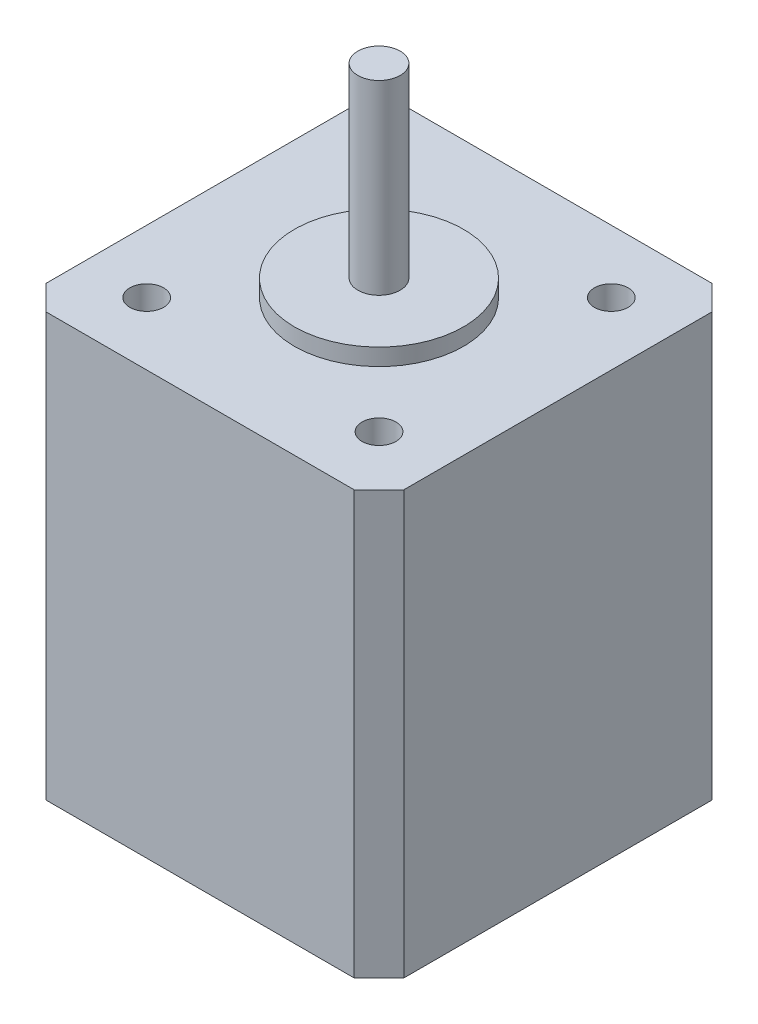
ISO-10303-21;
HEADER;
FILE_DESCRIPTION(('STEP AP214'),'2;1');
FILE_NAME('part.step','',(''),(''),'','','');
FILE_SCHEMA(('AUTOMOTIVE_DESIGN { 1 0 10303 214 1 1 1 1 }'));
ENDSEC;
DATA;
#1=APPLICATION_CONTEXT('core data for automotive mechanical design processes');
#2=APPLICATION_PROTOCOL_DEFINITION('international standard','automotive_design',2000,#1);
#3=PRODUCT_CONTEXT('',#1,'mechanical');
#4=PRODUCT('Part','Part','',(#3));
#5=PRODUCT_RELATED_PRODUCT_CATEGORY('part','',(#4));
#6=PRODUCT_DEFINITION_FORMATION('','',#4);
#7=PRODUCT_DEFINITION_CONTEXT('part definition',#1,'design');
#8=PRODUCT_DEFINITION('design','',#6,#7);
#9=PRODUCT_DEFINITION_SHAPE('','',#8);
#10=(LENGTH_UNIT() NAMED_UNIT(*) SI_UNIT(.MILLI.,.METRE.));
#11=(NAMED_UNIT(*) PLANE_ANGLE_UNIT() SI_UNIT($,.RADIAN.));
#12=(NAMED_UNIT(*) SI_UNIT($,.STERADIAN.) SOLID_ANGLE_UNIT());
#13=UNCERTAINTY_MEASURE_WITH_UNIT(LENGTH_MEASURE(1.E-05),#10,'distance_accuracy_value','');
#14=(GEOMETRIC_REPRESENTATION_CONTEXT(3) GLOBAL_UNCERTAINTY_ASSIGNED_CONTEXT((#13)) GLOBAL_UNIT_ASSIGNED_CONTEXT((#10,
#11,#12)) REPRESENTATION_CONTEXT('',''));
#15=CARTESIAN_POINT('',(0.,0.,0.));
#16=DIRECTION('',(0.,0.,1.));
#17=DIRECTION('',(1.,0.,0.));
#18=AXIS2_PLACEMENT_3D('',#15,#16,#17);
#19=CARTESIAN_POINT('',(-13.2034682080929,-50.,-17.7268786127169));
#20=DIRECTION('',(0.,0.,1.));
#21=DIRECTION('',(1.,0.,0.));
#22=AXIS2_PLACEMENT_3D('',#19,#20,#21);
#23=PLANE('',#22);
#24=DIRECTION('',(0.,-1.,0.));
#25=VECTOR('',#24,1.);
#26=CARTESIAN_POINT('',(8.22832369942179,-50.,-17.7268786127169));
#27=LINE('',#26,#25);
#28=CARTESIAN_POINT('',(8.22832369942179,-45.3103436402102,-17.7268786127169));
#29=VERTEX_POINT('',#28);
#30=CARTESIAN_POINT('',(8.22832369942179,-50.,-17.7268786127169));
#31=VERTEX_POINT('',#30);
#32=EDGE_CURVE('E162',#29,#31,#27,.T.);
#33=ORIENTED_EDGE('',*,*,#32,.F.);
#34=DIRECTION('',(1.,0.,0.));
#35=VECTOR('',#34,1.);
#36=CARTESIAN_POINT('',(8.22832369942179,-45.3103436402102,-17.7268786127169));
#37=LINE('',#36,#35);
#38=CARTESIAN_POINT('',(1.79653179190706,-45.3103436402102,-17.7268786127169));
#39=VERTEX_POINT('',#38);
#40=EDGE_CURVE('E315',#39,#29,#37,.T.);
#41=ORIENTED_EDGE('',*,*,#40,.F.);
#42=DIRECTION('',(0.,1.,0.));
#43=VECTOR('',#42,1.);
#44=CARTESIAN_POINT('',(1.79653179190706,-45.3103436402102,-17.7268786127169));
#45=LINE('',#44,#43);
#46=CARTESIAN_POINT('',(1.79653179190706,-50.,-17.7268786127169));
#47=VERTEX_POINT('',#46);
#48=EDGE_CURVE('E278',#47,#39,#45,.T.);
#49=ORIENTED_EDGE('',*,*,#48,.F.);
#50=DIRECTION('',(1.,0.,0.));
#51=VECTOR('',#50,1.);
#52=CARTESIAN_POINT('',(-13.2034682080929,-50.,-17.7268786127169));
#53=LINE('',#52,#51);
#54=CARTESIAN_POINT('',(-13.2034682080929,-50.,-17.7268786127169));
#55=VERTEX_POINT('',#54);
#56=EDGE_CURVE('E359',#55,#47,#53,.T.);
#57=ORIENTED_EDGE('',*,*,#56,.F.);
#58=DIRECTION('',(0.,1.,0.));
#59=VECTOR('',#58,1.);
#60=CARTESIAN_POINT('',(-13.2034682080929,-50.,-17.7268786127169));
#61=LINE('',#60,#59);
#62=CARTESIAN_POINT('',(-13.2034682080929,0.,-17.7268786127169));
#63=VERTEX_POINT('',#62);
#64=EDGE_CURVE('E413',#55,#63,#61,.T.);
#65=ORIENTED_EDGE('',*,*,#64,.T.);
#66=DIRECTION('',(1.,0.,0.));
#67=VECTOR('',#66,1.);
#68=CARTESIAN_POINT('',(-13.2034682080929,0.,-17.7268786127169));
#69=LINE('',#68,#67);
#70=CARTESIAN_POINT('',(23.2283236994218,0.,-17.7268786127169));
#71=VERTEX_POINT('',#70);
#72=EDGE_CURVE('E380',#63,#71,#69,.T.);
#73=ORIENTED_EDGE('',*,*,#72,.T.);
#74=DIRECTION('',(0.,1.,0.));
#75=VECTOR('',#74,1.);
#76=CARTESIAN_POINT('',(23.2283236994218,-50.,-17.7268786127169));
#77=LINE('',#76,#75);
#78=CARTESIAN_POINT('',(23.2283236994218,-50.,-17.7268786127169));
#79=VERTEX_POINT('',#78);
#80=EDGE_CURVE('E410',#79,#71,#77,.T.);
#81=ORIENTED_EDGE('',*,*,#80,.F.);
#82=EDGE_CURVE('E357',#31,#79,#53,.T.);
#83=ORIENTED_EDGE('',*,*,#82,.F.);
#84=EDGE_LOOP('',(#33,#41,#49,#57,#65,#73,#81,#83));
#85=FACE_BOUND('',#84,.T.);
#86=ADVANCED_FACE('F146',(#85),#23,.F.);
#87=CARTESIAN_POINT('',(5.01242774566448,2.,3.42312138728309));
#88=DIRECTION('',(0.,-1.,0.));
#89=DIRECTION('',(0.,0.,-1.));
#90=AXIS2_PLACEMENT_3D('',#87,#88,#89);
#91=CYLINDRICAL_SURFACE('',#90,10.);
#92=CARTESIAN_POINT('',(5.01242774566448,2.,3.42312138728309));
#93=DIRECTION('',(0.,1.,0.));
#94=DIRECTION('',(0.,0.,1.));
#95=AXIS2_PLACEMENT_3D('',#92,#93,#94);
#96=CIRCLE('',#95,10.);
#97=CARTESIAN_POINT('',(5.01242774566448,2.,13.4231213872831));
#98=VERTEX_POINT('',#97);
#99=EDGE_CURVE('E417',#98,#98,#96,.T.);
#100=ORIENTED_EDGE('',*,*,#99,.F.);
#101=EDGE_LOOP('',(#100));
#102=FACE_BOUND('',#101,.T.);
#103=CARTESIAN_POINT('',(5.01242774566448,0.,3.42312138728309));
#104=DIRECTION('',(0.,1.,0.));
#105=DIRECTION('',(0.,0.,1.));
#106=AXIS2_PLACEMENT_3D('',#103,#104,#105);
#107=CIRCLE('',#106,10.);
#108=CARTESIAN_POINT('',(5.01242774566448,0.,13.4231213872831));
#109=VERTEX_POINT('',#108);
#110=EDGE_CURVE('E416',#109,#109,#107,.T.);
#111=ORIENTED_EDGE('',*,*,#110,.T.);
#112=EDGE_LOOP('',(#111));
#113=FACE_BOUND('',#112,.T.);
#114=ADVANCED_FACE('F148',(#102,#113),#91,.T.);
#115=CARTESIAN_POINT('',(0.,2.,0.));
#116=DIRECTION('',(0.,1.,0.));
#117=DIRECTION('',(0.,0.,1.));
#118=AXIS2_PLACEMENT_3D('',#115,#116,#117);
#119=PLANE('',#118);
#120=CARTESIAN_POINT('',(5.01242774566448,2.,3.42312138728309));
#121=DIRECTION('',(0.,1.,0.));
#122=DIRECTION('',(0.,0.,1.));
#123=AXIS2_PLACEMENT_3D('',#120,#121,#122);
#124=CIRCLE('',#123,2.5);
#125=CARTESIAN_POINT('',(5.01242774566448,2.,5.92312138728309));
#126=VERTEX_POINT('',#125);
#127=EDGE_CURVE('E12',#126,#126,#124,.T.);
#128=ORIENTED_EDGE('',*,*,#127,.F.);
#129=EDGE_LOOP('',(#128));
#130=FACE_BOUND('',#129,.T.);
#131=ORIENTED_EDGE('',*,*,#99,.T.);
#132=EDGE_LOOP('',(#131));
#133=FACE_BOUND('',#132,.T.);
#134=ADVANCED_FACE('F461',(#130,#133),#119,.T.);
#135=CARTESIAN_POINT('',(-16.1375722543355,-50.,-14.7927745664743));
#136=DIRECTION('',(0.707106781186546,0.,0.707106781186549));
#137=DIRECTION('',(0.707106781186549,0.,-0.707106781186546));
#138=AXIS2_PLACEMENT_3D('',#135,#136,#137);
#139=PLANE('',#138);
#140=DIRECTION('',(0.707106781186549,0.,-0.707106781186547));
#141=VECTOR('',#140,1.);
#142=CARTESIAN_POINT('',(-16.1375722543355,0.,-14.7927745664743));
#143=LINE('',#142,#141);
#144=CARTESIAN_POINT('',(-16.1375722543355,0.,-14.7927745664743));
#145=VERTEX_POINT('',#144);
#146=EDGE_CURVE('E351',#145,#63,#143,.T.);
#147=ORIENTED_EDGE('',*,*,#146,.T.);
#148=ORIENTED_EDGE('',*,*,#64,.F.);
#149=DIRECTION('',(0.707106781186549,0.,-0.707106781186547));
#150=VECTOR('',#149,1.);
#151=CARTESIAN_POINT('',(-16.1375722543355,-50.,-14.7927745664743));
#152=LINE('',#151,#150);
#153=CARTESIAN_POINT('',(-16.1375722543355,-50.,-14.7927745664743));
#154=VERTEX_POINT('',#153);
#155=EDGE_CURVE('E354',#154,#55,#152,.T.);
#156=ORIENTED_EDGE('',*,*,#155,.F.);
#157=DIRECTION('',(0.,1.,0.));
#158=VECTOR('',#157,1.);
#159=CARTESIAN_POINT('',(-16.1375722543355,-50.,-14.7927745664743));
#160=LINE('',#159,#158);
#161=EDGE_CURVE('E377',#154,#145,#160,.T.);
#162=ORIENTED_EDGE('',*,*,#161,.T.);
#163=EDGE_LOOP('',(#147,#148,#156,#162));
#164=FACE_BOUND('',#163,.T.);
#165=ADVANCED_FACE('F467',(#164),#139,.F.);
#166=CARTESIAN_POINT('',(23.2283236994218,-50.,-17.7268786127169));
#167=DIRECTION('',(-0.707106781186538,0.,0.707106781186557));
#168=DIRECTION('',(0.707106781186557,0.,0.707106781186538));
#169=AXIS2_PLACEMENT_3D('',#166,#167,#168);
#170=PLANE('',#169);
#171=DIRECTION('',(0.707106781186557,0.,0.707106781186538));
#172=VECTOR('',#171,1.);
#173=CARTESIAN_POINT('',(23.2283236994218,0.,-17.7268786127169));
#174=LINE('',#173,#172);
#175=CARTESIAN_POINT('',(26.1624277456645,0.,-14.7927745664743));
#176=VERTEX_POINT('',#175);
#177=EDGE_CURVE('E382',#71,#176,#174,.T.);
#178=ORIENTED_EDGE('',*,*,#177,.T.);
#179=DIRECTION('',(0.,1.,0.));
#180=VECTOR('',#179,1.);
#181=CARTESIAN_POINT('',(26.1624277456645,-50.,-14.7927745664743));
#182=LINE('',#181,#180);
#183=CARTESIAN_POINT('',(26.1624277456645,-50.,-14.7927745664743));
#184=VERTEX_POINT('',#183);
#185=EDGE_CURVE('E408',#184,#176,#182,.T.);
#186=ORIENTED_EDGE('',*,*,#185,.F.);
#187=DIRECTION('',(0.707106781186557,0.,0.707106781186538));
#188=VECTOR('',#187,1.);
#189=CARTESIAN_POINT('',(23.2283236994218,-50.,-17.7268786127169));
#190=LINE('',#189,#188);
#191=EDGE_CURVE('E362',#79,#184,#190,.T.);
#192=ORIENTED_EDGE('',*,*,#191,.F.);
#193=ORIENTED_EDGE('',*,*,#80,.T.);
#194=EDGE_LOOP('',(#178,#186,#192,#193));
#195=FACE_BOUND('',#194,.T.);
#196=ADVANCED_FACE('F465',(#195),#170,.F.);
#197=CARTESIAN_POINT('',(26.1624277456645,-50.,21.6390173410403));
#198=DIRECTION('',(1.,0.,0.));
#199=DIRECTION('',(0.,0.,-1.));
#200=AXIS2_PLACEMENT_3D('',#197,#198,#199);
#201=PLANE('',#200);
#202=DIRECTION('',(0.,0.,-1.));
#203=VECTOR('',#202,1.);
#204=CARTESIAN_POINT('',(26.1624277456645,0.,21.6390173410403));
#205=LINE('',#204,#203);
#206=CARTESIAN_POINT('',(26.1624277456645,0.,21.6390173410403));
#207=VERTEX_POINT('',#206);
#208=EDGE_CURVE('E385',#207,#176,#205,.T.);
#209=ORIENTED_EDGE('',*,*,#208,.F.);
#210=DIRECTION('',(0.,1.,0.));
#211=VECTOR('',#210,1.);
#212=CARTESIAN_POINT('',(26.1624277456645,-50.,21.6390173410403));
#213=LINE('',#212,#211);
#214=CARTESIAN_POINT('',(26.1624277456645,-50.,21.6390173410403));
#215=VERTEX_POINT('',#214);
#216=EDGE_CURVE('E406',#215,#207,#213,.T.);
#217=ORIENTED_EDGE('',*,*,#216,.F.);
#218=DIRECTION('',(0.,0.,-1.));
#219=VECTOR('',#218,1.);
#220=CARTESIAN_POINT('',(26.1624277456645,-50.,21.6390173410403));
#221=LINE('',#220,#219);
#222=EDGE_CURVE('E364',#215,#184,#221,.T.);
#223=ORIENTED_EDGE('',*,*,#222,.T.);
#224=ORIENTED_EDGE('',*,*,#185,.T.);
#225=EDGE_LOOP('',(#209,#217,#223,#224));
#226=FACE_BOUND('',#225,.T.);
#227=ADVANCED_FACE('F519',(#226),#201,.T.);
#228=CARTESIAN_POINT('',(26.1624277456645,-50.,21.6390173410403));
#229=DIRECTION('',(-0.707106781186557,0.,-0.707106781186538));
#230=DIRECTION('',(-0.707106781186538,0.,0.707106781186557));
#231=AXIS2_PLACEMENT_3D('',#228,#229,#230);
#232=PLANE('',#231);
#233=DIRECTION('',(-0.707106781186538,0.,0.707106781186557));
#234=VECTOR('',#233,1.);
#235=CARTESIAN_POINT('',(26.1624277456645,0.,21.6390173410403));
#236=LINE('',#235,#234);
#237=CARTESIAN_POINT('',(23.2283236994218,0.,24.5731213872831));
#238=VERTEX_POINT('',#237);
#239=EDGE_CURVE('E388',#207,#238,#236,.T.);
#240=ORIENTED_EDGE('',*,*,#239,.T.);
#241=DIRECTION('',(0.,1.,0.));
#242=VECTOR('',#241,1.);
#243=CARTESIAN_POINT('',(23.2283236994218,-50.,24.5731213872831));
#244=LINE('',#243,#242);
#245=CARTESIAN_POINT('',(23.2283236994218,-50.,24.5731213872831));
#246=VERTEX_POINT('',#245);
#247=EDGE_CURVE('E404',#246,#238,#244,.T.);
#248=ORIENTED_EDGE('',*,*,#247,.F.);
#249=DIRECTION('',(-0.707106781186538,0.,0.707106781186557));
#250=VECTOR('',#249,1.);
#251=CARTESIAN_POINT('',(26.1624277456645,-50.,21.6390173410403));
#252=LINE('',#251,#250);
#253=EDGE_CURVE('E367',#215,#246,#252,.T.);
#254=ORIENTED_EDGE('',*,*,#253,.F.);
#255=ORIENTED_EDGE('',*,*,#216,.T.);
#256=EDGE_LOOP('',(#240,#248,#254,#255));
#257=FACE_BOUND('',#256,.T.);
#258=ADVANCED_FACE('F516',(#257),#232,.F.);
#259=CARTESIAN_POINT('',(-13.2034682080927,-50.,24.5731213872831));
#260=DIRECTION('',(0.,0.,1.));
#261=DIRECTION('',(1.,0.,0.));
#262=AXIS2_PLACEMENT_3D('',#259,#260,#261);
#263=PLANE('',#262);
#264=DIRECTION('',(1.,0.,0.));
#265=VECTOR('',#264,1.);
#266=CARTESIAN_POINT('',(-13.2034682080927,0.,24.5731213872831));
#267=LINE('',#266,#265);
#268=CARTESIAN_POINT('',(-13.2034682080927,0.,24.5731213872831));
#269=VERTEX_POINT('',#268);
#270=EDGE_CURVE('E391',#269,#238,#267,.T.);
#271=ORIENTED_EDGE('',*,*,#270,.F.);
#272=DIRECTION('',(0.,1.,0.));
#273=VECTOR('',#272,1.);
#274=CARTESIAN_POINT('',(-13.2034682080927,-50.,24.5731213872831));
#275=LINE('',#274,#273);
#276=CARTESIAN_POINT('',(-13.2034682080927,-50.,24.5731213872831));
#277=VERTEX_POINT('',#276);
#278=EDGE_CURVE('E402',#277,#269,#275,.T.);
#279=ORIENTED_EDGE('',*,*,#278,.F.);
#280=DIRECTION('',(1.,0.,0.));
#281=VECTOR('',#280,1.);
#282=CARTESIAN_POINT('',(-13.2034682080927,-50.,24.5731213872831));
#283=LINE('',#282,#281);
#284=EDGE_CURVE('E369',#277,#246,#283,.T.);
#285=ORIENTED_EDGE('',*,*,#284,.T.);
#286=ORIENTED_EDGE('',*,*,#247,.T.);
#287=EDGE_LOOP('',(#271,#279,#285,#286));
#288=FACE_BOUND('',#287,.T.);
#289=ADVANCED_FACE('F511',(#288),#263,.T.);
#290=CARTESIAN_POINT('',(-16.1375722543355,-50.,21.6390173410403));
#291=DIRECTION('',(-0.707106781186539,0.,0.707106781186556));
#292=DIRECTION('',(0.707106781186556,0.,0.707106781186539));
#293=AXIS2_PLACEMENT_3D('',#290,#291,#292);
#294=PLANE('',#293);
#295=DIRECTION('',(0.707106781186556,0.,0.707106781186539));
#296=VECTOR('',#295,1.);
#297=CARTESIAN_POINT('',(-16.1375722543355,0.,21.6390173410403));
#298=LINE('',#297,#296);
#299=CARTESIAN_POINT('',(-16.1375722543355,0.,21.6390173410403));
#300=VERTEX_POINT('',#299);
#301=EDGE_CURVE('E394',#300,#269,#298,.T.);
#302=ORIENTED_EDGE('',*,*,#301,.F.);
#303=DIRECTION('',(0.,1.,0.));
#304=VECTOR('',#303,1.);
#305=CARTESIAN_POINT('',(-16.1375722543355,-50.,21.6390173410403));
#306=LINE('',#305,#304);
#307=CARTESIAN_POINT('',(-16.1375722543355,-50.,21.6390173410403));
#308=VERTEX_POINT('',#307);
#309=EDGE_CURVE('E400',#308,#300,#306,.T.);
#310=ORIENTED_EDGE('',*,*,#309,.F.);
#311=DIRECTION('',(0.707106781186556,0.,0.707106781186539));
#312=VECTOR('',#311,1.);
#313=CARTESIAN_POINT('',(-16.1375722543355,-50.,21.6390173410403));
#314=LINE('',#313,#312);
#315=EDGE_CURVE('E372',#308,#277,#314,.T.);
#316=ORIENTED_EDGE('',*,*,#315,.T.);
#317=ORIENTED_EDGE('',*,*,#278,.T.);
#318=EDGE_LOOP('',(#302,#310,#316,#317));
#319=FACE_BOUND('',#318,.T.);
#320=ADVANCED_FACE('F506',(#319),#294,.T.);
#321=CARTESIAN_POINT('',(-16.1375722543355,-50.,21.6390173410403));
#322=DIRECTION('',(1.,0.,0.));
#323=DIRECTION('',(0.,0.,-1.));
#324=AXIS2_PLACEMENT_3D('',#321,#322,#323);
#325=PLANE('',#324);
#326=DIRECTION('',(0.,0.,-1.));
#327=VECTOR('',#326,1.);
#328=CARTESIAN_POINT('',(-16.1375722543355,0.,21.6390173410403));
#329=LINE('',#328,#327);
#330=EDGE_CURVE('E358',#300,#145,#329,.T.);
#331=ORIENTED_EDGE('',*,*,#330,.T.);
#332=ORIENTED_EDGE('',*,*,#161,.F.);
#333=DIRECTION('',(0.,0.,-1.));
#334=VECTOR('',#333,1.);
#335=CARTESIAN_POINT('',(-16.1375722543355,-50.,21.6390173410403));
#336=LINE('',#335,#334);
#337=EDGE_CURVE('E375',#308,#154,#336,.T.);
#338=ORIENTED_EDGE('',*,*,#337,.F.);
#339=ORIENTED_EDGE('',*,*,#309,.T.);
#340=EDGE_LOOP('',(#331,#332,#338,#339));
#341=FACE_BOUND('',#340,.T.);
#342=ADVANCED_FACE('F503',(#341),#325,.F.);
#343=CARTESIAN_POINT('',(0.,-50.,0.));
#344=DIRECTION('',(0.,-1.,0.));
#345=DIRECTION('',(0.,0.,-1.));
#346=AXIS2_PLACEMENT_3D('',#343,#344,#345);
#347=PLANE('',#346);
#348=CARTESIAN_POINT('',(18.7474277456645,-50.,17.1581213872833));
#349=DIRECTION('',(0.,1.,0.));
#350=DIRECTION('',(0.,0.,1.));
#351=AXIS2_PLACEMENT_3D('',#348,#349,#350);
#352=CIRCLE('',#351,2.);
#353=CARTESIAN_POINT('',(18.7474277456645,-50.,19.1581213872833));
#354=VERTEX_POINT('',#353);
#355=EDGE_CURVE('E330',#354,#354,#352,.T.);
#356=ORIENTED_EDGE('',*,*,#355,.T.);
#357=EDGE_LOOP('',(#356));
#358=FACE_BOUND('',#357,.T.);
#359=CARTESIAN_POINT('',(18.7474277456645,-50.,-10.3118786127167));
#360=DIRECTION('',(0.,1.,0.));
#361=DIRECTION('',(0.,0.,1.));
#362=AXIS2_PLACEMENT_3D('',#359,#360,#361);
#363=CIRCLE('',#362,1.99999999999986);
#364=CARTESIAN_POINT('',(18.7474277456645,-50.,-8.31187861271689));
#365=VERTEX_POINT('',#364);
#366=EDGE_CURVE('E336',#365,#365,#363,.T.);
#367=ORIENTED_EDGE('',*,*,#366,.T.);
#368=EDGE_LOOP('',(#367));
#369=FACE_BOUND('',#368,.T.);
#370=CARTESIAN_POINT('',(-8.72257225433554,-50.,-10.3118786127167));
#371=DIRECTION('',(0.,1.,0.));
#372=DIRECTION('',(0.,0.,1.));
#373=AXIS2_PLACEMENT_3D('',#370,#371,#372);
#374=CIRCLE('',#373,2.00000000000048);
#375=CARTESIAN_POINT('',(-8.72257225433554,-50.,-8.31187861271627));
#376=VERTEX_POINT('',#375);
#377=EDGE_CURVE('E342',#376,#376,#374,.T.);
#378=ORIENTED_EDGE('',*,*,#377,.T.);
#379=EDGE_LOOP('',(#378));
#380=FACE_BOUND('',#379,.T.);
#381=CARTESIAN_POINT('',(-8.72257225433554,-50.,17.1581213872833));
#382=DIRECTION('',(0.,1.,0.));
#383=DIRECTION('',(0.,0.,1.));
#384=AXIS2_PLACEMENT_3D('',#381,#382,#383);
#385=CIRCLE('',#384,2.00000000000034);
#386=CARTESIAN_POINT('',(-8.72257225433554,-50.,19.1581213872836));
#387=VERTEX_POINT('',#386);
#388=EDGE_CURVE('E348',#387,#387,#385,.T.);
#389=ORIENTED_EDGE('',*,*,#388,.T.);
#390=EDGE_LOOP('',(#389));
#391=FACE_BOUND('',#390,.T.);
#392=ORIENTED_EDGE('',*,*,#155,.T.);
#393=ORIENTED_EDGE('',*,*,#56,.T.);
#394=DIRECTION('',(0.,0.,1.));
#395=VECTOR('',#394,1.);
#396=CARTESIAN_POINT('',(1.79653179190705,-50.,-22.7268786127169));
#397=LINE('',#396,#395);
#398=CARTESIAN_POINT('',(1.79653179190705,-50.,-22.7268786127169));
#399=VERTEX_POINT('',#398);
#400=EDGE_CURVE('E326',#399,#47,#397,.T.);
#401=ORIENTED_EDGE('',*,*,#400,.F.);
#402=DIRECTION('',(-1.,0.,0.));
#403=VECTOR('',#402,1.);
#404=CARTESIAN_POINT('',(8.22832369942178,-50.,-22.7268786127169));
#405=LINE('',#404,#403);
#406=CARTESIAN_POINT('',(8.22832369942178,-50.,-22.7268786127169));
#407=VERTEX_POINT('',#406);
#408=EDGE_CURVE('E303',#407,#399,#405,.T.);
#409=ORIENTED_EDGE('',*,*,#408,.F.);
#410=DIRECTION('',(0.,0.,1.));
#411=VECTOR('',#410,1.);
#412=CARTESIAN_POINT('',(8.22832369942178,-50.,-22.7268786127169));
#413=LINE('',#412,#411);
#414=EDGE_CURVE('E312',#407,#31,#413,.T.);
#415=ORIENTED_EDGE('',*,*,#414,.T.);
#416=ORIENTED_EDGE('',*,*,#82,.T.);
#417=ORIENTED_EDGE('',*,*,#191,.T.);
#418=ORIENTED_EDGE('',*,*,#222,.F.);
#419=ORIENTED_EDGE('',*,*,#253,.T.);
#420=ORIENTED_EDGE('',*,*,#284,.F.);
#421=ORIENTED_EDGE('',*,*,#315,.F.);
#422=ORIENTED_EDGE('',*,*,#337,.T.);
#423=EDGE_LOOP('',(#392,#393,#401,#409,#415,#416,#417,#418,#419,#420,#421,#422));
#424=FACE_BOUND('',#423,.T.);
#425=ADVANCED_FACE('F484',(#358,#369,#380,#391,#424),#347,.T.);
#426=CARTESIAN_POINT('',(0.,0.,0.));
#427=DIRECTION('',(0.,-1.,0.));
#428=DIRECTION('',(0.,0.,-1.));
#429=AXIS2_PLACEMENT_3D('',#426,#427,#428);
#430=PLANE('',#429);
#431=ORIENTED_EDGE('',*,*,#110,.F.);
#432=EDGE_LOOP('',(#431));
#433=FACE_BOUND('',#432,.T.);
#434=CARTESIAN_POINT('',(18.7474277456645,0.,17.1581213872833));
#435=DIRECTION('',(0.,1.,0.));
#436=DIRECTION('',(0.,0.,1.));
#437=AXIS2_PLACEMENT_3D('',#434,#435,#436);
#438=CIRCLE('',#437,2.);
#439=CARTESIAN_POINT('',(18.7474277456645,0.,19.1581213872833));
#440=VERTEX_POINT('',#439);
#441=EDGE_CURVE('E329',#440,#440,#438,.T.);
#442=ORIENTED_EDGE('',*,*,#441,.F.);
#443=EDGE_LOOP('',(#442));
#444=FACE_BOUND('',#443,.T.);
#445=CARTESIAN_POINT('',(18.7474277456645,0.,-10.3118786127167));
#446=DIRECTION('',(0.,1.,0.));
#447=DIRECTION('',(0.,0.,1.));
#448=AXIS2_PLACEMENT_3D('',#445,#446,#447);
#449=CIRCLE('',#448,1.99999999999986);
#450=CARTESIAN_POINT('',(18.7474277456645,0.,-8.31187861271689));
#451=VERTEX_POINT('',#450);
#452=EDGE_CURVE('E333',#451,#451,#449,.T.);
#453=ORIENTED_EDGE('',*,*,#452,.F.);
#454=EDGE_LOOP('',(#453));
#455=FACE_BOUND('',#454,.T.);
#456=CARTESIAN_POINT('',(-8.72257225433554,0.,-10.3118786127167));
#457=DIRECTION('',(0.,1.,0.));
#458=DIRECTION('',(0.,0.,1.));
#459=AXIS2_PLACEMENT_3D('',#456,#457,#458);
#460=CIRCLE('',#459,2.00000000000048);
#461=CARTESIAN_POINT('',(-8.72257225433554,0.,-8.31187861271627));
#462=VERTEX_POINT('',#461);
#463=EDGE_CURVE('E339',#462,#462,#460,.T.);
#464=ORIENTED_EDGE('',*,*,#463,.F.);
#465=EDGE_LOOP('',(#464));
#466=FACE_BOUND('',#465,.T.);
#467=CARTESIAN_POINT('',(-8.72257225433554,0.,17.1581213872833));
#468=DIRECTION('',(0.,1.,0.));
#469=DIRECTION('',(0.,0.,1.));
#470=AXIS2_PLACEMENT_3D('',#467,#468,#469);
#471=CIRCLE('',#470,2.00000000000034);
#472=CARTESIAN_POINT('',(-8.72257225433554,0.,19.1581213872836));
#473=VERTEX_POINT('',#472);
#474=EDGE_CURVE('E345',#473,#473,#471,.T.);
#475=ORIENTED_EDGE('',*,*,#474,.F.);
#476=EDGE_LOOP('',(#475));
#477=FACE_BOUND('',#476,.T.);
#478=ORIENTED_EDGE('',*,*,#146,.F.);
#479=ORIENTED_EDGE('',*,*,#330,.F.);
#480=ORIENTED_EDGE('',*,*,#301,.T.);
#481=ORIENTED_EDGE('',*,*,#270,.T.);
#482=ORIENTED_EDGE('',*,*,#239,.F.);
#483=ORIENTED_EDGE('',*,*,#208,.T.);
#484=ORIENTED_EDGE('',*,*,#177,.F.);
#485=ORIENTED_EDGE('',*,*,#72,.F.);
#486=EDGE_LOOP('',(#478,#479,#480,#481,#482,#483,#484,#485));
#487=FACE_BOUND('',#486,.T.);
#488=ADVANCED_FACE('F480',(#433,#444,#455,#466,#477,#487),#430,.F.);
#489=CARTESIAN_POINT('',(-8.72257225433554,-50.,17.1581213872833));
#490=DIRECTION('',(0.,1.,0.));
#491=DIRECTION('',(0.,0.,1.));
#492=AXIS2_PLACEMENT_3D('',#489,#490,#491);
#493=CYLINDRICAL_SURFACE('',#492,2.00000000000034);
#494=ORIENTED_EDGE('',*,*,#388,.F.);
#495=EDGE_LOOP('',(#494));
#496=FACE_BOUND('',#495,.T.);
#497=ORIENTED_EDGE('',*,*,#474,.T.);
#498=EDGE_LOOP('',(#497));
#499=FACE_BOUND('',#498,.T.);
#500=ADVANCED_FACE('F483',(#496,#499),#493,.F.);
#501=CARTESIAN_POINT('',(-8.72257225433554,-50.,-10.3118786127167));
#502=DIRECTION('',(0.,1.,0.));
#503=DIRECTION('',(0.,0.,1.));
#504=AXIS2_PLACEMENT_3D('',#501,#502,#503);
#505=CYLINDRICAL_SURFACE('',#504,2.00000000000048);
#506=ORIENTED_EDGE('',*,*,#377,.F.);
#507=EDGE_LOOP('',(#506));
#508=FACE_BOUND('',#507,.T.);
#509=ORIENTED_EDGE('',*,*,#463,.T.);
#510=EDGE_LOOP('',(#509));
#511=FACE_BOUND('',#510,.T.);
#512=ADVANCED_FACE('F559',(#508,#511),#505,.F.);
#513=CARTESIAN_POINT('',(18.7474277456645,-50.,-10.3118786127167));
#514=DIRECTION('',(0.,1.,0.));
#515=DIRECTION('',(0.,0.,1.));
#516=AXIS2_PLACEMENT_3D('',#513,#514,#515);
#517=CYLINDRICAL_SURFACE('',#516,1.99999999999986);
#518=ORIENTED_EDGE('',*,*,#366,.F.);
#519=EDGE_LOOP('',(#518));
#520=FACE_BOUND('',#519,.T.);
#521=ORIENTED_EDGE('',*,*,#452,.T.);
#522=EDGE_LOOP('',(#521));
#523=FACE_BOUND('',#522,.T.);
#524=ADVANCED_FACE('F547',(#520,#523),#517,.F.);
#525=CARTESIAN_POINT('',(18.7474277456645,-50.,17.1581213872833));
#526=DIRECTION('',(0.,1.,0.));
#527=DIRECTION('',(0.,0.,1.));
#528=AXIS2_PLACEMENT_3D('',#525,#526,#527);
#529=CYLINDRICAL_SURFACE('',#528,2.);
#530=ORIENTED_EDGE('',*,*,#355,.F.);
#531=EDGE_LOOP('',(#530));
#532=FACE_BOUND('',#531,.T.);
#533=ORIENTED_EDGE('',*,*,#441,.T.);
#534=EDGE_LOOP('',(#533));
#535=FACE_BOUND('',#534,.T.);
#536=ADVANCED_FACE('F540',(#532,#535),#529,.F.);
#537=CARTESIAN_POINT('',(0.,0.,-22.7268786127169));
#538=DIRECTION('',(0.,0.,1.));
#539=DIRECTION('',(1.,0.,0.));
#540=AXIS2_PLACEMENT_3D('',#537,#538,#539);
#541=PLANE('',#540);
#542=ORIENTED_EDGE('',*,*,#408,.T.);
#543=DIRECTION('',(0.,1.,0.));
#544=VECTOR('',#543,1.);
#545=CARTESIAN_POINT('',(1.79653179190705,-45.3103436402102,-22.7268786127169));
#546=LINE('',#545,#544);
#547=CARTESIAN_POINT('',(1.79653179190705,-45.3103436402102,-22.7268786127169));
#548=VERTEX_POINT('',#547);
#549=EDGE_CURVE('E306',#399,#548,#546,.T.);
#550=ORIENTED_EDGE('',*,*,#549,.T.);
#551=DIRECTION('',(1.,0.,0.));
#552=VECTOR('',#551,1.);
#553=CARTESIAN_POINT('',(8.22832369942178,-45.3103436402102,-22.7268786127169));
#554=LINE('',#553,#552);
#555=CARTESIAN_POINT('',(8.22832369942178,-45.3103436402102,-22.7268786127169));
#556=VERTEX_POINT('',#555);
#557=EDGE_CURVE('E308',#548,#556,#554,.T.);
#558=ORIENTED_EDGE('',*,*,#557,.T.);
#559=DIRECTION('',(0.,-1.,0.));
#560=VECTOR('',#559,1.);
#561=CARTESIAN_POINT('',(8.22832369942178,-50.,-22.7268786127169));
#562=LINE('',#561,#560);
#563=EDGE_CURVE('E310',#556,#407,#562,.T.);
#564=ORIENTED_EDGE('',*,*,#563,.T.);
#565=EDGE_LOOP('',(#542,#550,#558,#564));
#566=FACE_BOUND('',#565,.T.);
#567=DIRECTION('',(1.,0.,0.));
#568=VECTOR('',#567,1.);
#569=CARTESIAN_POINT('',(2.82988580652341,-46.1453924042843,-22.7268786127169));
#570=LINE('',#569,#568);
#571=CARTESIAN_POINT('',(2.82988580652341,-46.1453924042843,-22.7268786127169));
#572=VERTEX_POINT('',#571);
#573=CARTESIAN_POINT('',(7.34155568603964,-46.1453924042843,-22.7268786127169));
#574=VERTEX_POINT('',#573);
#575=EDGE_CURVE('E262',#572,#574,#570,.T.);
#576=ORIENTED_EDGE('',*,*,#575,.F.);
#577=DIRECTION('',(0.,1.,0.));
#578=VECTOR('',#577,1.);
#579=CARTESIAN_POINT('',(2.82988580652341,-49.3359772483331,-22.7268786127169));
#580=LINE('',#579,#578);
#581=CARTESIAN_POINT('',(2.82988580652341,-49.3359772483331,-22.7268786127169));
#582=VERTEX_POINT('',#581);
#583=EDGE_CURVE('E286',#582,#572,#580,.T.);
#584=ORIENTED_EDGE('',*,*,#583,.F.);
#585=DIRECTION('',(-1.,0.,0.));
#586=VECTOR('',#585,1.);
#587=CARTESIAN_POINT('',(7.34155568603964,-49.3359772483331,-22.7268786127169));
#588=LINE('',#587,#586);
#589=CARTESIAN_POINT('',(7.34155568603964,-49.3359772483331,-22.7268786127169));
#590=VERTEX_POINT('',#589);
#591=EDGE_CURVE('E284',#590,#582,#588,.T.);
#592=ORIENTED_EDGE('',*,*,#591,.F.);
#593=DIRECTION('',(0.,-1.,0.));
#594=VECTOR('',#593,1.);
#595=CARTESIAN_POINT('',(7.34155568603964,-46.1453924042843,-22.7268786127169));
#596=LINE('',#595,#594);
#597=EDGE_CURVE('E271',#574,#590,#596,.T.);
#598=ORIENTED_EDGE('',*,*,#597,.F.);
#599=EDGE_LOOP('',(#576,#584,#592,#598));
#600=FACE_BOUND('',#599,.T.);
#601=ADVANCED_FACE('F282',(#566,#600),#541,.F.);
#602=CARTESIAN_POINT('',(1.79653179190705,-45.3103436402102,-22.7268786127169));
#603=DIRECTION('',(1.,0.,0.));
#604=DIRECTION('',(0.,0.,-1.));
#605=AXIS2_PLACEMENT_3D('',#602,#603,#604);
#606=PLANE('',#605);
#607=ORIENTED_EDGE('',*,*,#48,.T.);
#608=DIRECTION('',(0.,0.,1.));
#609=VECTOR('',#608,1.);
#610=CARTESIAN_POINT('',(1.79653179190705,-45.3103436402102,-22.7268786127169));
#611=LINE('',#610,#609);
#612=EDGE_CURVE('E323',#548,#39,#611,.T.);
#613=ORIENTED_EDGE('',*,*,#612,.F.);
#614=ORIENTED_EDGE('',*,*,#549,.F.);
#615=ORIENTED_EDGE('',*,*,#400,.T.);
#616=EDGE_LOOP('',(#607,#613,#614,#615));
#617=FACE_BOUND('',#616,.T.);
#618=ADVANCED_FACE('F537',(#617),#606,.F.);
#619=CARTESIAN_POINT('',(8.22832369942178,-45.3103436402102,-22.7268786127169));
#620=DIRECTION('',(0.,-1.,0.));
#621=DIRECTION('',(0.,0.,-1.));
#622=AXIS2_PLACEMENT_3D('',#619,#620,#621);
#623=PLANE('',#622);
#624=ORIENTED_EDGE('',*,*,#40,.T.);
#625=DIRECTION('',(0.,0.,1.));
#626=VECTOR('',#625,1.);
#627=CARTESIAN_POINT('',(8.22832369942178,-45.3103436402102,-22.7268786127169));
#628=LINE('',#627,#626);
#629=EDGE_CURVE('E320',#556,#29,#628,.T.);
#630=ORIENTED_EDGE('',*,*,#629,.F.);
#631=ORIENTED_EDGE('',*,*,#557,.F.);
#632=ORIENTED_EDGE('',*,*,#612,.T.);
#633=EDGE_LOOP('',(#624,#630,#631,#632));
#634=FACE_BOUND('',#633,.T.);
#635=ADVANCED_FACE('F534',(#634),#623,.F.);
#636=CARTESIAN_POINT('',(8.22832369942178,-50.,-22.7268786127169));
#637=DIRECTION('',(-1.,0.,0.));
#638=DIRECTION('',(0.,0.,1.));
#639=AXIS2_PLACEMENT_3D('',#636,#637,#638);
#640=PLANE('',#639);
#641=ORIENTED_EDGE('',*,*,#32,.T.);
#642=ORIENTED_EDGE('',*,*,#414,.F.);
#643=ORIENTED_EDGE('',*,*,#563,.F.);
#644=ORIENTED_EDGE('',*,*,#629,.T.);
#645=EDGE_LOOP('',(#641,#642,#643,#644));
#646=FACE_BOUND('',#645,.T.);
#647=ADVANCED_FACE('F530',(#646),#640,.F.);
#648=CARTESIAN_POINT('',(2.82988580652341,-46.1453924042843,-22.7268786127169));
#649=DIRECTION('',(0.,-1.,0.));
#650=DIRECTION('',(0.,0.,-1.));
#651=AXIS2_PLACEMENT_3D('',#648,#649,#650);
#652=PLANE('',#651);
#653=DIRECTION('',(1.,0.,0.));
#654=VECTOR('',#653,1.);
#655=CARTESIAN_POINT('',(2.82988580652342,-46.1453924042843,-17.7268786127169));
#656=LINE('',#655,#654);
#657=CARTESIAN_POINT('',(2.82988580652342,-46.1453924042843,-17.7268786127169));
#658=VERTEX_POINT('',#657);
#659=CARTESIAN_POINT('',(7.34155568603965,-46.1453924042843,-17.7268786127169));
#660=VERTEX_POINT('',#659);
#661=EDGE_CURVE('E291',#658,#660,#656,.T.);
#662=ORIENTED_EDGE('',*,*,#661,.F.);
#663=DIRECTION('',(0.,0.,1.));
#664=VECTOR('',#663,1.);
#665=CARTESIAN_POINT('',(2.82988580652341,-46.1453924042843,-22.7268786127169));
#666=LINE('',#665,#664);
#667=EDGE_CURVE('E267',#572,#658,#666,.T.);
#668=ORIENTED_EDGE('',*,*,#667,.F.);
#669=ORIENTED_EDGE('',*,*,#575,.T.);
#670=DIRECTION('',(0.,0.,1.));
#671=VECTOR('',#670,1.);
#672=CARTESIAN_POINT('',(7.34155568603964,-46.1453924042843,-22.7268786127169));
#673=LINE('',#672,#671);
#674=EDGE_CURVE('E265',#574,#660,#673,.T.);
#675=ORIENTED_EDGE('',*,*,#674,.T.);
#676=EDGE_LOOP('',(#662,#668,#669,#675));
#677=FACE_BOUND('',#676,.T.);
#678=ADVANCED_FACE('F264',(#677),#652,.T.);
#679=CARTESIAN_POINT('',(7.34155568603964,-46.1453924042843,-22.7268786127169));
#680=DIRECTION('',(-1.,0.,0.));
#681=DIRECTION('',(0.,0.,1.));
#682=AXIS2_PLACEMENT_3D('',#679,#680,#681);
#683=PLANE('',#682);
#684=DIRECTION('',(0.,-1.,0.));
#685=VECTOR('',#684,1.);
#686=CARTESIAN_POINT('',(7.34155568603965,-46.1453924042843,-17.7268786127169));
#687=LINE('',#686,#685);
#688=CARTESIAN_POINT('',(7.34155568603965,-49.3359772483331,-17.7268786127169));
#689=VERTEX_POINT('',#688);
#690=EDGE_CURVE('E277',#660,#689,#687,.T.);
#691=ORIENTED_EDGE('',*,*,#690,.F.);
#692=ORIENTED_EDGE('',*,*,#674,.F.);
#693=ORIENTED_EDGE('',*,*,#597,.T.);
#694=DIRECTION('',(0.,0.,1.));
#695=VECTOR('',#694,1.);
#696=CARTESIAN_POINT('',(7.34155568603964,-49.3359772483331,-22.7268786127169));
#697=LINE('',#696,#695);
#698=EDGE_CURVE('E279',#590,#689,#697,.T.);
#699=ORIENTED_EDGE('',*,*,#698,.T.);
#700=EDGE_LOOP('',(#691,#692,#693,#699));
#701=FACE_BOUND('',#700,.T.);
#702=ADVANCED_FACE('F274',(#701),#683,.T.);
#703=CARTESIAN_POINT('',(7.34155568603964,-49.3359772483331,-22.7268786127169));
#704=DIRECTION('',(0.,1.,0.));
#705=DIRECTION('',(0.,0.,1.));
#706=AXIS2_PLACEMENT_3D('',#703,#704,#705);
#707=PLANE('',#706);
#708=DIRECTION('',(-1.,0.,0.));
#709=VECTOR('',#708,1.);
#710=CARTESIAN_POINT('',(7.34155568603965,-49.3359772483331,-17.7268786127169));
#711=LINE('',#710,#709);
#712=CARTESIAN_POINT('',(2.82988580652342,-49.3359772483331,-17.7268786127169));
#713=VERTEX_POINT('',#712);
#714=EDGE_CURVE('E295',#689,#713,#711,.T.);
#715=ORIENTED_EDGE('',*,*,#714,.F.);
#716=ORIENTED_EDGE('',*,*,#698,.F.);
#717=ORIENTED_EDGE('',*,*,#591,.T.);
#718=DIRECTION('',(0.,0.,1.));
#719=VECTOR('',#718,1.);
#720=CARTESIAN_POINT('',(2.82988580652341,-49.3359772483331,-22.7268786127169));
#721=LINE('',#720,#719);
#722=EDGE_CURVE('E300',#582,#713,#721,.T.);
#723=ORIENTED_EDGE('',*,*,#722,.T.);
#724=EDGE_LOOP('',(#715,#716,#717,#723));
#725=FACE_BOUND('',#724,.T.);
#726=ADVANCED_FACE('F449',(#725),#707,.T.);
#727=CARTESIAN_POINT('',(2.82988580652341,-49.3359772483331,-22.7268786127169));
#728=DIRECTION('',(1.,0.,0.));
#729=DIRECTION('',(0.,0.,-1.));
#730=AXIS2_PLACEMENT_3D('',#727,#728,#729);
#731=PLANE('',#730);
#732=DIRECTION('',(0.,1.,0.));
#733=VECTOR('',#732,1.);
#734=CARTESIAN_POINT('',(2.82988580652342,-49.3359772483331,-17.7268786127169));
#735=LINE('',#734,#733);
#736=EDGE_CURVE('E170',#713,#658,#735,.T.);
#737=ORIENTED_EDGE('',*,*,#736,.F.);
#738=ORIENTED_EDGE('',*,*,#722,.F.);
#739=ORIENTED_EDGE('',*,*,#583,.T.);
#740=ORIENTED_EDGE('',*,*,#667,.T.);
#741=EDGE_LOOP('',(#737,#738,#739,#740));
#742=FACE_BOUND('',#741,.T.);
#743=ADVANCED_FACE('F440',(#742),#731,.T.);
#744=CARTESIAN_POINT('',(3.59063955480552,-47.7693140041708,-17.7268786127169));
#745=DIRECTION('',(0.,0.,1.));
#746=DIRECTION('',(1.,0.,0.));
#747=AXIS2_PLACEMENT_3D('',#744,#745,#746);
#748=CIRCLE('',#747,0.2);
#749=CARTESIAN_POINT('',(3.79063955480552,-47.7693140041708,-17.7268786127169));
#750=VERTEX_POINT('',#749);
#751=EDGE_CURVE('E150',#750,#750,#748,.F.);
#752=ORIENTED_EDGE('',*,*,#751,.F.);
#753=EDGE_LOOP('',(#752));
#754=FACE_BOUND('',#753,.T.);
#755=CARTESIAN_POINT('',(4.57474905685283,-47.7693140041708,-17.7268786127169));
#756=DIRECTION('',(0.,0.,1.));
#757=DIRECTION('',(1.,0.,0.));
#758=AXIS2_PLACEMENT_3D('',#755,#756,#757);
#759=CIRCLE('',#758,0.199999999999999);
#760=CARTESIAN_POINT('',(4.77474905685282,-47.7693140041708,-17.7268786127169));
#761=VERTEX_POINT('',#760);
#762=EDGE_CURVE('E427',#761,#761,#759,.F.);
#763=ORIENTED_EDGE('',*,*,#762,.F.);
#764=EDGE_LOOP('',(#763));
#765=FACE_BOUND('',#764,.T.);
#766=CARTESIAN_POINT('',(5.52125461833695,-47.7693140041708,-17.7268786127169));
#767=DIRECTION('',(0.,0.,1.));
#768=DIRECTION('',(1.,0.,0.));
#769=AXIS2_PLACEMENT_3D('',#766,#767,#768);
#770=CIRCLE('',#769,0.199999999999999);
#771=CARTESIAN_POINT('',(5.72125461833695,-47.7693140041708,-17.7268786127169));
#772=VERTEX_POINT('',#771);
#773=EDGE_CURVE('E425',#772,#772,#770,.F.);
#774=ORIENTED_EDGE('',*,*,#773,.F.);
#775=EDGE_LOOP('',(#774));
#776=FACE_BOUND('',#775,.T.);
#777=CARTESIAN_POINT('',(6.59729278503372,-47.7693140041708,-17.7268786127169));
#778=DIRECTION('',(0.,0.,1.));
#779=DIRECTION('',(1.,0.,0.));
#780=AXIS2_PLACEMENT_3D('',#777,#778,#779);
#781=CIRCLE('',#780,0.199999999999999);
#782=CARTESIAN_POINT('',(6.79729278503372,-47.7693140041708,-17.7268786127169));
#783=VERTEX_POINT('',#782);
#784=EDGE_CURVE('E420',#783,#783,#781,.F.);
#785=ORIENTED_EDGE('',*,*,#784,.F.);
#786=EDGE_LOOP('',(#785));
#787=FACE_BOUND('',#786,.T.);
#788=ORIENTED_EDGE('',*,*,#714,.T.);
#789=ORIENTED_EDGE('',*,*,#736,.T.);
#790=ORIENTED_EDGE('',*,*,#661,.T.);
#791=ORIENTED_EDGE('',*,*,#690,.T.);
#792=EDGE_LOOP('',(#788,#789,#790,#791));
#793=FACE_BOUND('',#792,.T.);
#794=ADVANCED_FACE('F436',(#754,#765,#776,#787,#793),#23,.F.);
#795=CARTESIAN_POINT('',(6.59729278503371,-47.7693140041708,-21.7268786127169));
#796=DIRECTION('',(0.,0.,1.));
#797=DIRECTION('',(1.,0.,0.));
#798=AXIS2_PLACEMENT_3D('',#795,#796,#797);
#799=CYLINDRICAL_SURFACE('',#798,0.199999999999999);
#800=CARTESIAN_POINT('',(6.59729278503371,-47.7693140041708,-21.7268786127169));
#801=DIRECTION('',(0.,0.,-1.));
#802=DIRECTION('',(-1.,0.,0.));
#803=AXIS2_PLACEMENT_3D('',#800,#801,#802);
#804=CIRCLE('',#803,0.199999999999999);
#805=CARTESIAN_POINT('',(6.39729278503371,-47.7693140041708,-21.7268786127169));
#806=VERTEX_POINT('',#805);
#807=EDGE_CURVE('E293',#806,#806,#804,.T.);
#808=ORIENTED_EDGE('',*,*,#807,.F.);
#809=EDGE_LOOP('',(#808));
#810=FACE_BOUND('',#809,.T.);
#811=ORIENTED_EDGE('',*,*,#784,.T.);
#812=EDGE_LOOP('',(#811));
#813=FACE_BOUND('',#812,.T.);
#814=ADVANCED_FACE('F439',(#810,#813),#799,.T.);
#815=CARTESIAN_POINT('',(6.59729278503371,-47.7693140041708,-21.7268786127169));
#816=DIRECTION('',(0.,0.,-1.));
#817=DIRECTION('',(-1.,0.,0.));
#818=AXIS2_PLACEMENT_3D('',#815,#816,#817);
#819=PLANE('',#818);
#820=ORIENTED_EDGE('',*,*,#807,.T.);
#821=EDGE_LOOP('',(#820));
#822=FACE_BOUND('',#821,.T.);
#823=ADVANCED_FACE('F670',(#822),#819,.T.);
#824=CARTESIAN_POINT('',(5.52125461833694,-47.7693140041708,-21.7268786127169));
#825=DIRECTION('',(0.,0.,1.));
#826=DIRECTION('',(1.,0.,0.));
#827=AXIS2_PLACEMENT_3D('',#824,#825,#826);
#828=CYLINDRICAL_SURFACE('',#827,0.199999999999999);
#829=CARTESIAN_POINT('',(5.52125461833694,-47.7693140041708,-21.7268786127169));
#830=DIRECTION('',(0.,0.,-1.));
#831=DIRECTION('',(-1.,0.,0.));
#832=AXIS2_PLACEMENT_3D('',#829,#830,#831);
#833=CIRCLE('',#832,0.199999999999999);
#834=CARTESIAN_POINT('',(5.32125461833694,-47.7693140041708,-21.7268786127169));
#835=VERTEX_POINT('',#834);
#836=EDGE_CURVE('E850',#835,#835,#833,.T.);
#837=ORIENTED_EDGE('',*,*,#836,.F.);
#838=EDGE_LOOP('',(#837));
#839=FACE_BOUND('',#838,.T.);
#840=ORIENTED_EDGE('',*,*,#773,.T.);
#841=EDGE_LOOP('',(#840));
#842=FACE_BOUND('',#841,.T.);
#843=ADVANCED_FACE('F662',(#839,#842),#828,.T.);
#844=CARTESIAN_POINT('',(5.52125461833694,-47.7693140041708,-21.7268786127169));
#845=DIRECTION('',(0.,0.,-1.));
#846=DIRECTION('',(-1.,0.,0.));
#847=AXIS2_PLACEMENT_3D('',#844,#845,#846);
#848=PLANE('',#847);
#849=ORIENTED_EDGE('',*,*,#836,.T.);
#850=EDGE_LOOP('',(#849));
#851=FACE_BOUND('',#850,.T.);
#852=ADVANCED_FACE('F654',(#851),#848,.T.);
#853=CARTESIAN_POINT('',(4.57474905685282,-47.7693140041708,-21.7268786127169));
#854=DIRECTION('',(0.,0.,1.));
#855=DIRECTION('',(1.,0.,0.));
#856=AXIS2_PLACEMENT_3D('',#853,#854,#855);
#857=CYLINDRICAL_SURFACE('',#856,0.199999999999999);
#858=CARTESIAN_POINT('',(4.57474905685282,-47.7693140041708,-21.7268786127169));
#859=DIRECTION('',(0.,0.,-1.));
#860=DIRECTION('',(-1.,0.,0.));
#861=AXIS2_PLACEMENT_3D('',#858,#859,#860);
#862=CIRCLE('',#861,0.199999999999999);
#863=CARTESIAN_POINT('',(4.37474905685282,-47.7693140041708,-21.7268786127169));
#864=VERTEX_POINT('',#863);
#865=EDGE_CURVE('E852',#864,#864,#862,.T.);
#866=ORIENTED_EDGE('',*,*,#865,.F.);
#867=EDGE_LOOP('',(#866));
#868=FACE_BOUND('',#867,.T.);
#869=ORIENTED_EDGE('',*,*,#762,.T.);
#870=EDGE_LOOP('',(#869));
#871=FACE_BOUND('',#870,.T.);
#872=ADVANCED_FACE('F646',(#868,#871),#857,.T.);
#873=CARTESIAN_POINT('',(4.57474905685282,-47.7693140041708,-21.7268786127169));
#874=DIRECTION('',(0.,0.,-1.));
#875=DIRECTION('',(-1.,0.,0.));
#876=AXIS2_PLACEMENT_3D('',#873,#874,#875);
#877=PLANE('',#876);
#878=ORIENTED_EDGE('',*,*,#865,.T.);
#879=EDGE_LOOP('',(#878));
#880=FACE_BOUND('',#879,.T.);
#881=ADVANCED_FACE('F638',(#880),#877,.T.);
#882=CARTESIAN_POINT('',(3.59063955480552,-47.7693140041708,-21.7268786127169));
#883=DIRECTION('',(0.,0.,1.));
#884=DIRECTION('',(1.,0.,0.));
#885=AXIS2_PLACEMENT_3D('',#882,#883,#884);
#886=CYLINDRICAL_SURFACE('',#885,0.2);
#887=CARTESIAN_POINT('',(3.59063955480552,-47.7693140041708,-21.7268786127169));
#888=DIRECTION('',(0.,0.,-1.));
#889=DIRECTION('',(-1.,0.,0.));
#890=AXIS2_PLACEMENT_3D('',#887,#888,#889);
#891=CIRCLE('',#890,0.2);
#892=CARTESIAN_POINT('',(3.39063955480552,-47.7693140041708,-21.7268786127169));
#893=VERTEX_POINT('',#892);
#894=EDGE_CURVE('E857',#893,#893,#891,.T.);
#895=ORIENTED_EDGE('',*,*,#894,.F.);
#896=EDGE_LOOP('',(#895));
#897=FACE_BOUND('',#896,.T.);
#898=ORIENTED_EDGE('',*,*,#751,.T.);
#899=EDGE_LOOP('',(#898));
#900=FACE_BOUND('',#899,.T.);
#901=ADVANCED_FACE('F434',(#897,#900),#886,.T.);
#902=CARTESIAN_POINT('',(3.59063955480552,-47.7693140041708,-21.7268786127169));
#903=DIRECTION('',(0.,0.,-1.));
#904=DIRECTION('',(-1.,0.,0.));
#905=AXIS2_PLACEMENT_3D('',#902,#903,#904);
#906=PLANE('',#905);
#907=ORIENTED_EDGE('',*,*,#894,.T.);
#908=EDGE_LOOP('',(#907));
#909=FACE_BOUND('',#908,.T.);
#910=ADVANCED_FACE('F605',(#909),#906,.T.);
#911=CARTESIAN_POINT('',(5.01242774566448,24.,3.42312138728309));
#912=DIRECTION('',(0.,-1.,0.));
#913=DIRECTION('',(0.,0.,-1.));
#914=AXIS2_PLACEMENT_3D('',#911,#912,#913);
#915=CYLINDRICAL_SURFACE('',#914,2.5);
#916=CARTESIAN_POINT('',(5.01242774566448,24.,3.42312138728309));
#917=DIRECTION('',(0.,1.,0.));
#918=DIRECTION('',(0.,0.,1.));
#919=AXIS2_PLACEMENT_3D('',#916,#917,#918);
#920=CIRCLE('',#919,2.5);
#921=CARTESIAN_POINT('',(5.01242774566448,24.,5.92312138728309));
#922=VERTEX_POINT('',#921);
#923=EDGE_CURVE('E859',#922,#922,#920,.T.);
#924=ORIENTED_EDGE('',*,*,#923,.F.);
#925=EDGE_LOOP('',(#924));
#926=FACE_BOUND('',#925,.T.);
#927=ORIENTED_EDGE('',*,*,#127,.T.);
#928=EDGE_LOOP('',(#927));
#929=FACE_BOUND('',#928,.T.);
#930=ADVANCED_FACE('F610',(#926,#929),#915,.T.);
#931=CARTESIAN_POINT('',(5.01242774566448,24.,3.42312138728309));
#932=DIRECTION('',(0.,1.,0.));
#933=DIRECTION('',(0.,0.,1.));
#934=AXIS2_PLACEMENT_3D('',#931,#932,#933);
#935=PLANE('',#934);
#936=ORIENTED_EDGE('',*,*,#923,.T.);
#937=EDGE_LOOP('',(#936));
#938=FACE_BOUND('',#937,.T.);
#939=ADVANCED_FACE('F616',(#938),#935,.T.);
#940=CLOSED_SHELL('',(#86,#114,#134,#165,#196,#227,#258,#289,#320,#342,#425,#488,#500,#512,#524,
#536,#601,#618,#635,#647,#678,#702,#726,#743,#794,#814,#823,#843,#852,#872,#881,#901,#910,#930,#939));
#941=MANIFOLD_SOLID_BREP('B2',#940);
#942=ADVANCED_BREP_SHAPE_REPRESENTATION('',(#18,#941),#14);
#943=SHAPE_DEFINITION_REPRESENTATION(#9,#942);
ENDSEC;
END-ISO-10303-21;
